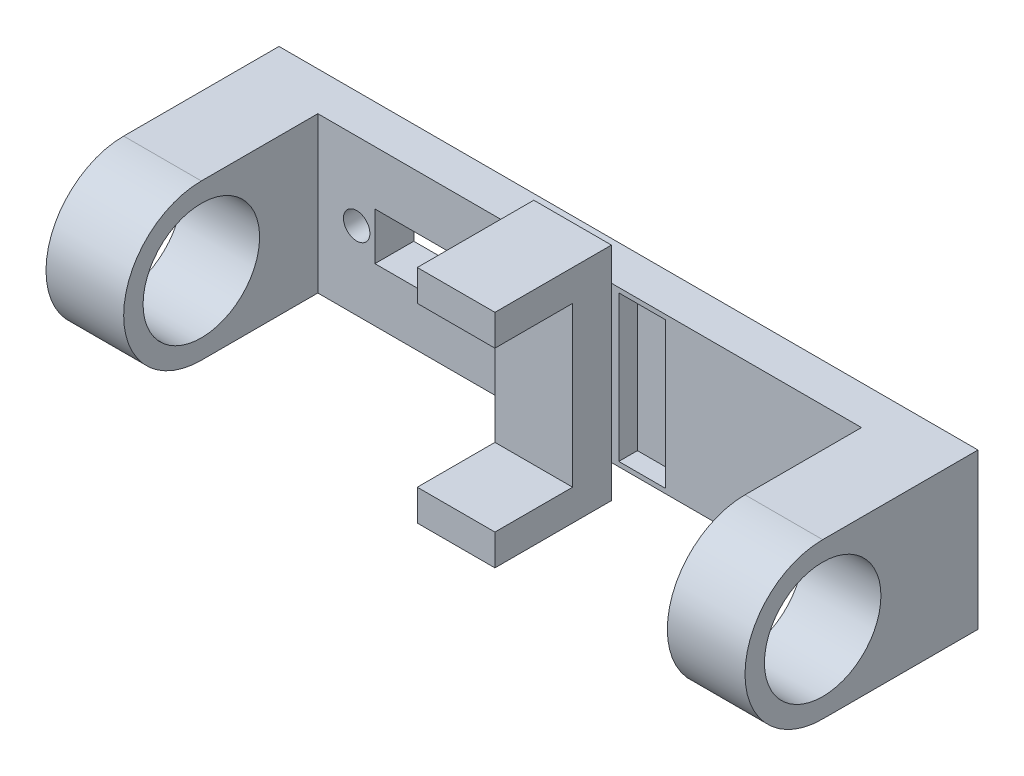
ISO-10303-21;
HEADER;
FILE_DESCRIPTION(('STEP AP214'),'2;1');
FILE_NAME('part.step','',(''),(''),'','','');
FILE_SCHEMA(('AUTOMOTIVE_DESIGN { 1 0 10303 214 1 1 1 1 }'));
ENDSEC;
DATA;
#1=APPLICATION_CONTEXT('core data for automotive mechanical design processes');
#2=APPLICATION_PROTOCOL_DEFINITION('international standard','automotive_design',2000,#1);
#3=PRODUCT_CONTEXT('',#1,'mechanical');
#4=PRODUCT('Part','Part','',(#3));
#5=PRODUCT_RELATED_PRODUCT_CATEGORY('part','',(#4));
#6=PRODUCT_DEFINITION_FORMATION('','',#4);
#7=PRODUCT_DEFINITION_CONTEXT('part definition',#1,'design');
#8=PRODUCT_DEFINITION('design','',#6,#7);
#9=PRODUCT_DEFINITION_SHAPE('','',#8);
#10=(LENGTH_UNIT() NAMED_UNIT(*) SI_UNIT(.MILLI.,.METRE.));
#11=(NAMED_UNIT(*) PLANE_ANGLE_UNIT() SI_UNIT($,.RADIAN.));
#12=(NAMED_UNIT(*) SI_UNIT($,.STERADIAN.) SOLID_ANGLE_UNIT());
#13=UNCERTAINTY_MEASURE_WITH_UNIT(LENGTH_MEASURE(1.E-05),#10,'distance_accuracy_value','');
#14=(GEOMETRIC_REPRESENTATION_CONTEXT(3) GLOBAL_UNCERTAINTY_ASSIGNED_CONTEXT((#13)) GLOBAL_UNIT_ASSIGNED_CONTEXT((#10,
#11,#12)) REPRESENTATION_CONTEXT('',''));
#15=CARTESIAN_POINT('',(0.,0.,0.));
#16=DIRECTION('',(0.,0.,1.));
#17=DIRECTION('',(1.,0.,0.));
#18=AXIS2_PLACEMENT_3D('',#15,#16,#17);
#19=CARTESIAN_POINT('',(0.,0.,10.));
#20=DIRECTION('',(0.,0.,1.));
#21=DIRECTION('',(1.,0.,0.));
#22=AXIS2_PLACEMENT_3D('',#19,#20,#21);
#23=PLANE('',#22);
#24=DIRECTION('',(0.,-1.,0.));
#25=VECTOR('',#24,1.);
#26=CARTESIAN_POINT('',(37.8030734964749,24.2512093375647,10.));
#27=LINE('',#26,#25);
#28=CARTESIAN_POINT('',(37.8030734964749,20.2512093375647,10.));
#29=VERTEX_POINT('',#28);
#30=CARTESIAN_POINT('',(37.8030734964749,-0.248790662435282,10.));
#31=VERTEX_POINT('',#30);
#32=EDGE_CURVE('E284',#29,#31,#27,.T.);
#33=ORIENTED_EDGE('',*,*,#32,.T.);
#34=DIRECTION('',(-1.,0.,0.));
#35=VECTOR('',#34,1.);
#36=CARTESIAN_POINT('',(37.8030734964749,-0.248790662435282,10.));
#37=LINE('',#36,#35);
#38=CARTESIAN_POINT('',(47.8030734964749,-0.248790662435282,10.));
#39=VERTEX_POINT('',#38);
#40=EDGE_CURVE('E245',#39,#31,#37,.T.);
#41=ORIENTED_EDGE('',*,*,#40,.F.);
#42=DIRECTION('',(0.,1.,0.));
#43=VECTOR('',#42,1.);
#44=CARTESIAN_POINT('',(47.8030734964749,24.2512093375647,10.));
#45=LINE('',#44,#43);
#46=CARTESIAN_POINT('',(47.8030734964749,20.2512093375647,10.));
#47=VERTEX_POINT('',#46);
#48=EDGE_CURVE('E287',#39,#47,#45,.T.);
#49=ORIENTED_EDGE('',*,*,#48,.T.);
#50=DIRECTION('',(1.,0.,0.));
#51=VECTOR('',#50,1.);
#52=CARTESIAN_POINT('',(37.8030734964749,20.2512093375647,10.));
#53=LINE('',#52,#51);
#54=EDGE_CURVE('E65',#29,#47,#53,.T.);
#55=ORIENTED_EDGE('',*,*,#54,.F.);
#56=EDGE_LOOP('',(#33,#41,#49,#55));
#57=FACE_BOUND('',#56,.T.);
#58=ADVANCED_FACE('F41',(#57),#23,.T.);
#59=CARTESIAN_POINT('',(0.,0.,5.));
#60=DIRECTION('',(0.,0.,-1.));
#61=DIRECTION('',(-1.,0.,0.));
#62=AXIS2_PLACEMENT_3D('',#59,#60,#61);
#63=PLANE('',#62);
#64=DIRECTION('',(0.,1.,0.));
#65=VECTOR('',#64,1.);
#66=CARTESIAN_POINT('',(32.35,13.05,5.));
#67=LINE('',#66,#65);
#68=CARTESIAN_POINT('',(32.35,6.95000000000001,5.));
#69=VERTEX_POINT('',#68);
#70=CARTESIAN_POINT('',(32.35,13.05,5.));
#71=VERTEX_POINT('',#70);
#72=EDGE_CURVE('E340',#69,#71,#67,.T.);
#73=ORIENTED_EDGE('',*,*,#72,.F.);
#74=DIRECTION('',(1.,0.,0.));
#75=VECTOR('',#74,1.);
#76=CARTESIAN_POINT('',(17.35,6.95,5.));
#77=LINE('',#76,#75);
#78=CARTESIAN_POINT('',(17.35,6.95,5.));
#79=VERTEX_POINT('',#78);
#80=EDGE_CURVE('E344',#79,#69,#77,.T.);
#81=ORIENTED_EDGE('',*,*,#80,.F.);
#82=DIRECTION('',(0.,-1.,0.));
#83=VECTOR('',#82,1.);
#84=CARTESIAN_POINT('',(17.35,13.05,5.));
#85=LINE('',#84,#83);
#86=CARTESIAN_POINT('',(17.35,13.05,5.));
#87=VERTEX_POINT('',#86);
#88=EDGE_CURVE('E335',#87,#79,#85,.T.);
#89=ORIENTED_EDGE('',*,*,#88,.F.);
#90=DIRECTION('',(-1.,0.,0.));
#91=VECTOR('',#90,1.);
#92=CARTESIAN_POINT('',(17.35,13.05,5.));
#93=LINE('',#92,#91);
#94=EDGE_CURVE('E336',#71,#87,#93,.T.);
#95=ORIENTED_EDGE('',*,*,#94,.F.);
#96=EDGE_LOOP('',(#73,#81,#89,#95));
#97=FACE_BOUND('',#96,.T.);
#98=CARTESIAN_POINT('',(15.,10.,5.));
#99=DIRECTION('',(0.,0.,1.));
#100=DIRECTION('',(1.,0.,0.));
#101=AXIS2_PLACEMENT_3D('',#98,#99,#100);
#102=CIRCLE('',#101,1.7);
#103=CARTESIAN_POINT('',(16.7,10.,5.));
#104=VERTEX_POINT('',#103);
#105=EDGE_CURVE('E319',#104,#104,#102,.T.);
#106=ORIENTED_EDGE('',*,*,#105,.F.);
#107=EDGE_LOOP('',(#106));
#108=FACE_BOUND('',#107,.T.);
#109=DIRECTION('',(0.,-1.,0.));
#110=VECTOR('',#109,1.);
#111=CARTESIAN_POINT('',(37.8030734964749,24.2512093375647,5.));
#112=LINE('',#111,#110);
#113=CARTESIAN_POINT('',(37.8030734964749,20.,5.));
#114=VERTEX_POINT('',#113);
#115=CARTESIAN_POINT('',(37.8030734964749,0.,5.));
#116=VERTEX_POINT('',#115);
#117=EDGE_CURVE('E296',#114,#116,#112,.T.);
#118=ORIENTED_EDGE('',*,*,#117,.F.);
#119=DIRECTION('',(-1.,0.,0.));
#120=VECTOR('',#119,1.);
#121=CARTESIAN_POINT('',(0.,20.,5.));
#122=LINE('',#121,#120);
#123=CARTESIAN_POINT('',(10.,20.,5.));
#124=VERTEX_POINT('',#123);
#125=EDGE_CURVE('E494',#114,#124,#122,.T.);
#126=ORIENTED_EDGE('',*,*,#125,.T.);
#127=DIRECTION('',(0.,1.,0.));
#128=VECTOR('',#127,1.);
#129=CARTESIAN_POINT('',(10.,0.,5.));
#130=LINE('',#129,#128);
#131=CARTESIAN_POINT('',(10.,0.,5.));
#132=VERTEX_POINT('',#131);
#133=EDGE_CURVE('E478',#132,#124,#130,.T.);
#134=ORIENTED_EDGE('',*,*,#133,.F.);
#135=DIRECTION('',(1.,0.,0.));
#136=VECTOR('',#135,1.);
#137=CARTESIAN_POINT('',(0.,0.,5.));
#138=LINE('',#137,#136);
#139=EDGE_CURVE('E490',#132,#116,#138,.T.);
#140=ORIENTED_EDGE('',*,*,#139,.T.);
#141=EDGE_LOOP('',(#118,#126,#134,#140));
#142=FACE_BOUND('',#141,.T.);
#143=ADVANCED_FACE('F584',(#97,#108,#142),#63,.F.);
#144=DIRECTION('',(0.,1.,0.));
#145=VECTOR('',#144,1.);
#146=CARTESIAN_POINT('',(54.75,19.4,5.));
#147=LINE('',#146,#145);
#148=CARTESIAN_POINT('',(54.75,0.600000000000001,5.));
#149=VERTEX_POINT('',#148);
#150=CARTESIAN_POINT('',(54.75,19.4,5.));
#151=VERTEX_POINT('',#150);
#152=EDGE_CURVE('E384',#149,#151,#147,.T.);
#153=ORIENTED_EDGE('',*,*,#152,.F.);
#154=DIRECTION('',(1.,0.,0.));
#155=VECTOR('',#154,1.);
#156=CARTESIAN_POINT('',(48.75,0.6,5.));
#157=LINE('',#156,#155);
#158=CARTESIAN_POINT('',(48.75,0.6,5.));
#159=VERTEX_POINT('',#158);
#160=EDGE_CURVE('E388',#159,#149,#157,.T.);
#161=ORIENTED_EDGE('',*,*,#160,.F.);
#162=DIRECTION('',(0.,-1.,0.));
#163=VECTOR('',#162,1.);
#164=CARTESIAN_POINT('',(48.75,19.4,5.));
#165=LINE('',#164,#163);
#166=CARTESIAN_POINT('',(48.75,19.4,5.));
#167=VERTEX_POINT('',#166);
#168=EDGE_CURVE('E379',#167,#159,#165,.T.);
#169=ORIENTED_EDGE('',*,*,#168,.F.);
#170=DIRECTION('',(-1.,0.,0.));
#171=VECTOR('',#170,1.);
#172=CARTESIAN_POINT('',(48.75,19.4,5.));
#173=LINE('',#172,#171);
#174=EDGE_CURVE('E380',#151,#167,#173,.T.);
#175=ORIENTED_EDGE('',*,*,#174,.F.);
#176=EDGE_LOOP('',(#153,#161,#169,#175));
#177=FACE_BOUND('',#176,.T.);
#178=CARTESIAN_POINT('',(75.,10.,5.));
#179=DIRECTION('',(0.,0.,1.));
#180=DIRECTION('',(1.,0.,0.));
#181=AXIS2_PLACEMENT_3D('',#178,#179,#180);
#182=CIRCLE('',#181,1.69999999999999);
#183=CARTESIAN_POINT('',(76.7,10.,5.));
#184=VERTEX_POINT('',#183);
#185=EDGE_CURVE('E327',#184,#184,#182,.T.);
#186=ORIENTED_EDGE('',*,*,#185,.F.);
#187=EDGE_LOOP('',(#186));
#188=FACE_BOUND('',#187,.T.);
#189=DIRECTION('',(0.,1.,0.));
#190=VECTOR('',#189,1.);
#191=CARTESIAN_POINT('',(47.8030734964749,24.2512093375647,5.));
#192=LINE('',#191,#190);
#193=CARTESIAN_POINT('',(47.8030734964749,0.,5.));
#194=VERTEX_POINT('',#193);
#195=CARTESIAN_POINT('',(47.8030734964749,20.,5.));
#196=VERTEX_POINT('',#195);
#197=EDGE_CURVE('E304',#194,#196,#192,.T.);
#198=ORIENTED_EDGE('',*,*,#197,.F.);
#199=CARTESIAN_POINT('',(80.,0.,5.));
#200=VERTEX_POINT('',#199);
#201=EDGE_CURVE('E495',#194,#200,#138,.T.);
#202=ORIENTED_EDGE('',*,*,#201,.T.);
#203=DIRECTION('',(0.,1.,0.));
#204=VECTOR('',#203,1.);
#205=CARTESIAN_POINT('',(80.,0.,5.));
#206=LINE('',#205,#204);
#207=CARTESIAN_POINT('',(80.,20.,5.));
#208=VERTEX_POINT('',#207);
#209=EDGE_CURVE('E446',#200,#208,#206,.T.);
#210=ORIENTED_EDGE('',*,*,#209,.T.);
#211=EDGE_CURVE('E496',#208,#196,#122,.T.);
#212=ORIENTED_EDGE('',*,*,#211,.T.);
#213=EDGE_LOOP('',(#198,#202,#210,#212));
#214=FACE_BOUND('',#213,.T.);
#215=ADVANCED_FACE('F611',(#177,#188,#214),#63,.F.);
#216=CARTESIAN_POINT('',(0.,0.,0.));
#217=DIRECTION('',(0.,0.,-1.));
#218=DIRECTION('',(-1.,0.,0.));
#219=AXIS2_PLACEMENT_3D('',#216,#217,#218);
#220=PLANE('',#219);
#221=DIRECTION('',(0.,-1.,0.));
#222=VECTOR('',#221,1.);
#223=CARTESIAN_POINT('',(0.,0.,0.));
#224=LINE('',#223,#222);
#225=CARTESIAN_POINT('',(0.,20.,0.));
#226=VERTEX_POINT('',#225);
#227=CARTESIAN_POINT('',(0.,0.,0.));
#228=VERTEX_POINT('',#227);
#229=EDGE_CURVE('E489',#226,#228,#224,.T.);
#230=ORIENTED_EDGE('',*,*,#229,.F.);
#231=DIRECTION('',(-1.,0.,0.));
#232=VECTOR('',#231,1.);
#233=CARTESIAN_POINT('',(0.,20.,0.));
#234=LINE('',#233,#232);
#235=CARTESIAN_POINT('',(90.,20.,0.));
#236=VERTEX_POINT('',#235);
#237=EDGE_CURVE('E513',#236,#226,#234,.T.);
#238=ORIENTED_EDGE('',*,*,#237,.F.);
#239=DIRECTION('',(0.,1.,0.));
#240=VECTOR('',#239,1.);
#241=CARTESIAN_POINT('',(90.,0.,0.));
#242=LINE('',#241,#240);
#243=CARTESIAN_POINT('',(90.,0.,0.));
#244=VERTEX_POINT('',#243);
#245=EDGE_CURVE('E509',#244,#236,#242,.T.);
#246=ORIENTED_EDGE('',*,*,#245,.F.);
#247=DIRECTION('',(1.,0.,0.));
#248=VECTOR('',#247,1.);
#249=CARTESIAN_POINT('',(0.,0.,0.));
#250=LINE('',#249,#248);
#251=EDGE_CURVE('E505',#228,#244,#250,.T.);
#252=ORIENTED_EDGE('',*,*,#251,.F.);
#253=EDGE_LOOP('',(#230,#238,#246,#252));
#254=FACE_BOUND('',#253,.T.);
#255=DIRECTION('',(1.,0.,0.));
#256=VECTOR('',#255,1.);
#257=CARTESIAN_POINT('',(17.35,6.95,0.));
#258=LINE('',#257,#256);
#259=CARTESIAN_POINT('',(17.35,6.95,0.));
#260=VERTEX_POINT('',#259);
#261=CARTESIAN_POINT('',(32.35,6.95000000000001,0.));
#262=VERTEX_POINT('',#261);
#263=EDGE_CURVE('E339',#260,#262,#258,.T.);
#264=ORIENTED_EDGE('',*,*,#263,.T.);
#265=DIRECTION('',(0.,1.,0.));
#266=VECTOR('',#265,1.);
#267=CARTESIAN_POINT('',(32.35,13.05,0.));
#268=LINE('',#267,#266);
#269=CARTESIAN_POINT('',(32.35,13.05,0.));
#270=VERTEX_POINT('',#269);
#271=EDGE_CURVE('E366',#262,#270,#268,.T.);
#272=ORIENTED_EDGE('',*,*,#271,.T.);
#273=DIRECTION('',(-1.,0.,0.));
#274=VECTOR('',#273,1.);
#275=CARTESIAN_POINT('',(17.35,13.05,0.));
#276=LINE('',#275,#274);
#277=CARTESIAN_POINT('',(17.35,13.05,0.));
#278=VERTEX_POINT('',#277);
#279=EDGE_CURVE('E361',#270,#278,#276,.T.);
#280=ORIENTED_EDGE('',*,*,#279,.T.);
#281=DIRECTION('',(0.,-1.,0.));
#282=VECTOR('',#281,1.);
#283=CARTESIAN_POINT('',(17.35,13.05,0.));
#284=LINE('',#283,#282);
#285=EDGE_CURVE('E355',#278,#260,#284,.T.);
#286=ORIENTED_EDGE('',*,*,#285,.T.);
#287=EDGE_LOOP('',(#264,#272,#280,#286));
#288=FACE_BOUND('',#287,.T.);
#289=CARTESIAN_POINT('',(75.,10.,0.));
#290=DIRECTION('',(0.,0.,1.));
#291=DIRECTION('',(1.,0.,0.));
#292=AXIS2_PLACEMENT_3D('',#289,#290,#291);
#293=CIRCLE('',#292,1.69999999999999);
#294=CARTESIAN_POINT('',(76.7,10.,0.));
#295=VERTEX_POINT('',#294);
#296=EDGE_CURVE('E331',#295,#295,#293,.T.);
#297=ORIENTED_EDGE('',*,*,#296,.T.);
#298=EDGE_LOOP('',(#297));
#299=FACE_BOUND('',#298,.T.);
#300=CARTESIAN_POINT('',(15.,10.,0.));
#301=DIRECTION('',(0.,0.,1.));
#302=DIRECTION('',(1.,0.,0.));
#303=AXIS2_PLACEMENT_3D('',#300,#301,#302);
#304=CIRCLE('',#303,1.7);
#305=CARTESIAN_POINT('',(16.7,10.,0.));
#306=VERTEX_POINT('',#305);
#307=EDGE_CURVE('E323',#306,#306,#304,.T.);
#308=ORIENTED_EDGE('',*,*,#307,.T.);
#309=EDGE_LOOP('',(#308));
#310=FACE_BOUND('',#309,.T.);
#311=ADVANCED_FACE('F536',(#254,#288,#299,#310),#220,.T.);
#312=CARTESIAN_POINT('',(0.,0.,5.));
#313=DIRECTION('',(0.,1.,0.));
#314=DIRECTION('',(0.,0.,1.));
#315=AXIS2_PLACEMENT_3D('',#312,#313,#314);
#316=PLANE('',#315);
#317=DIRECTION('',(1.,0.,0.));
#318=VECTOR('',#317,1.);
#319=CARTESIAN_POINT('',(-15.,0.,20.));
#320=LINE('',#319,#318);
#321=CARTESIAN_POINT('',(80.,0.,20.));
#322=VERTEX_POINT('',#321);
#323=CARTESIAN_POINT('',(90.,0.,20.));
#324=VERTEX_POINT('',#323);
#325=EDGE_CURVE('E433',#322,#324,#320,.T.);
#326=ORIENTED_EDGE('',*,*,#325,.F.);
#327=DIRECTION('',(0.,0.,-1.));
#328=VECTOR('',#327,1.);
#329=CARTESIAN_POINT('',(80.,0.,35.));
#330=LINE('',#329,#328);
#331=EDGE_CURVE('E450',#322,#200,#330,.T.);
#332=ORIENTED_EDGE('',*,*,#331,.T.);
#333=ORIENTED_EDGE('',*,*,#201,.F.);
#334=DIRECTION('',(1.,0.,0.));
#335=VECTOR('',#334,1.);
#336=CARTESIAN_POINT('',(0.,0.,5.));
#337=LINE('',#336,#335);
#338=EDGE_CURVE('E229',#116,#194,#337,.T.);
#339=ORIENTED_EDGE('',*,*,#338,.F.);
#340=ORIENTED_EDGE('',*,*,#139,.F.);
#341=DIRECTION('',(0.,0.,-1.));
#342=VECTOR('',#341,1.);
#343=CARTESIAN_POINT('',(10.,0.,35.));
#344=LINE('',#343,#342);
#345=CARTESIAN_POINT('',(10.,0.,20.));
#346=VERTEX_POINT('',#345);
#347=EDGE_CURVE('E486',#346,#132,#344,.T.);
#348=ORIENTED_EDGE('',*,*,#347,.F.);
#349=DIRECTION('',(-1.,0.,0.));
#350=VECTOR('',#349,1.);
#351=CARTESIAN_POINT('',(35.,0.,20.));
#352=LINE('',#351,#350);
#353=CARTESIAN_POINT('',(0.,0.,20.));
#354=VERTEX_POINT('',#353);
#355=EDGE_CURVE('E462',#346,#354,#352,.T.);
#356=ORIENTED_EDGE('',*,*,#355,.T.);
#357=DIRECTION('',(0.,0.,-1.));
#358=VECTOR('',#357,1.);
#359=CARTESIAN_POINT('',(0.,0.,5.));
#360=LINE('',#359,#358);
#361=EDGE_CURVE('E12',#354,#228,#360,.T.);
#362=ORIENTED_EDGE('',*,*,#361,.T.);
#363=ORIENTED_EDGE('',*,*,#251,.T.);
#364=DIRECTION('',(0.,0.,-1.));
#365=VECTOR('',#364,1.);
#366=CARTESIAN_POINT('',(90.,0.,5.));
#367=LINE('',#366,#365);
#368=EDGE_CURVE('E50',#324,#244,#367,.T.);
#369=ORIENTED_EDGE('',*,*,#368,.F.);
#370=EDGE_LOOP('',(#326,#332,#333,#339,#340,#348,#356,#362,#363,#369));
#371=FACE_BOUND('',#370,.T.);
#372=ADVANCED_FACE('F532',(#371),#316,.F.);
#373=CARTESIAN_POINT('',(0.,0.,5.));
#374=DIRECTION('',(1.,0.,0.));
#375=DIRECTION('',(0.,0.,-1.));
#376=AXIS2_PLACEMENT_3D('',#373,#374,#375);
#377=PLANE('',#376);
#378=CARTESIAN_POINT('',(0.,10.,20.));
#379=DIRECTION('',(-1.,0.,0.));
#380=DIRECTION('',(0.,0.,1.));
#381=AXIS2_PLACEMENT_3D('',#378,#379,#380);
#382=CIRCLE('',#381,7.5);
#383=CARTESIAN_POINT('',(0.,10.,27.5));
#384=VERTEX_POINT('',#383);
#385=EDGE_CURVE('E461',#384,#384,#382,.T.);
#386=ORIENTED_EDGE('',*,*,#385,.F.);
#387=EDGE_LOOP('',(#386));
#388=FACE_BOUND('',#387,.T.);
#389=ORIENTED_EDGE('',*,*,#361,.F.);
#390=CARTESIAN_POINT('',(0.,10.,20.));
#391=DIRECTION('',(1.,0.,0.));
#392=DIRECTION('',(0.,0.,1.));
#393=AXIS2_PLACEMENT_3D('',#390,#391,#392);
#394=CIRCLE('',#393,10.);
#395=CARTESIAN_POINT('',(0.,20.,20.));
#396=VERTEX_POINT('',#395);
#397=EDGE_CURVE('E457',#396,#354,#394,.T.);
#398=ORIENTED_EDGE('',*,*,#397,.F.);
#399=DIRECTION('',(0.,0.,-1.));
#400=VECTOR('',#399,1.);
#401=CARTESIAN_POINT('',(0.,20.,5.));
#402=LINE('',#401,#400);
#403=EDGE_CURVE('E500',#396,#226,#402,.T.);
#404=ORIENTED_EDGE('',*,*,#403,.T.);
#405=ORIENTED_EDGE('',*,*,#229,.T.);
#406=EDGE_LOOP('',(#389,#398,#404,#405));
#407=FACE_BOUND('',#406,.T.);
#408=ADVANCED_FACE('F43',(#388,#407),#377,.F.);
#409=CARTESIAN_POINT('',(90.,0.,5.));
#410=DIRECTION('',(-1.,0.,0.));
#411=DIRECTION('',(0.,0.,1.));
#412=AXIS2_PLACEMENT_3D('',#409,#410,#411);
#413=PLANE('',#412);
#414=CARTESIAN_POINT('',(90.,10.,20.));
#415=DIRECTION('',(1.,0.,0.));
#416=DIRECTION('',(0.,0.,1.));
#417=AXIS2_PLACEMENT_3D('',#414,#415,#416);
#418=CIRCLE('',#417,10.);
#419=CARTESIAN_POINT('',(90.,20.,20.));
#420=VERTEX_POINT('',#419);
#421=EDGE_CURVE('E423',#420,#324,#418,.T.);
#422=ORIENTED_EDGE('',*,*,#421,.T.);
#423=ORIENTED_EDGE('',*,*,#368,.T.);
#424=ORIENTED_EDGE('',*,*,#245,.T.);
#425=DIRECTION('',(0.,0.,-1.));
#426=VECTOR('',#425,1.);
#427=CARTESIAN_POINT('',(90.,20.,5.));
#428=LINE('',#427,#426);
#429=EDGE_CURVE('E519',#420,#236,#428,.T.);
#430=ORIENTED_EDGE('',*,*,#429,.F.);
#431=EDGE_LOOP('',(#422,#423,#424,#430));
#432=FACE_BOUND('',#431,.T.);
#433=CARTESIAN_POINT('',(90.,10.,20.));
#434=DIRECTION('',(-1.,0.,0.));
#435=DIRECTION('',(0.,0.,1.));
#436=AXIS2_PLACEMENT_3D('',#433,#434,#435);
#437=CIRCLE('',#436,7.5);
#438=CARTESIAN_POINT('',(90.,10.,27.5));
#439=VERTEX_POINT('',#438);
#440=EDGE_CURVE('E428',#439,#439,#437,.T.);
#441=ORIENTED_EDGE('',*,*,#440,.T.);
#442=EDGE_LOOP('',(#441));
#443=FACE_BOUND('',#442,.T.);
#444=ADVANCED_FACE('F524',(#432,#443),#413,.F.);
#445=CARTESIAN_POINT('',(0.,20.,5.));
#446=DIRECTION('',(0.,-1.,0.));
#447=DIRECTION('',(0.,0.,-1.));
#448=AXIS2_PLACEMENT_3D('',#445,#446,#447);
#449=PLANE('',#448);
#450=DIRECTION('',(0.,0.,-1.));
#451=VECTOR('',#450,1.);
#452=CARTESIAN_POINT('',(80.,20.,35.));
#453=LINE('',#452,#451);
#454=CARTESIAN_POINT('',(80.,20.,20.));
#455=VERTEX_POINT('',#454);
#456=EDGE_CURVE('E454',#455,#208,#453,.T.);
#457=ORIENTED_EDGE('',*,*,#456,.F.);
#458=DIRECTION('',(1.,0.,0.));
#459=VECTOR('',#458,1.);
#460=CARTESIAN_POINT('',(-15.,20.,20.));
#461=LINE('',#460,#459);
#462=EDGE_CURVE('E429',#455,#420,#461,.T.);
#463=ORIENTED_EDGE('',*,*,#462,.T.);
#464=ORIENTED_EDGE('',*,*,#429,.T.);
#465=ORIENTED_EDGE('',*,*,#237,.T.);
#466=ORIENTED_EDGE('',*,*,#403,.F.);
#467=DIRECTION('',(-1.,0.,0.));
#468=VECTOR('',#467,1.);
#469=CARTESIAN_POINT('',(35.,20.,20.));
#470=LINE('',#469,#468);
#471=CARTESIAN_POINT('',(10.,20.,20.));
#472=VERTEX_POINT('',#471);
#473=EDGE_CURVE('E465',#472,#396,#470,.T.);
#474=ORIENTED_EDGE('',*,*,#473,.F.);
#475=DIRECTION('',(0.,0.,-1.));
#476=VECTOR('',#475,1.);
#477=CARTESIAN_POINT('',(10.,20.,35.));
#478=LINE('',#477,#476);
#479=EDGE_CURVE('E482',#472,#124,#478,.T.);
#480=ORIENTED_EDGE('',*,*,#479,.T.);
#481=ORIENTED_EDGE('',*,*,#125,.F.);
#482=EDGE_CURVE('E501',#196,#114,#122,.T.);
#483=ORIENTED_EDGE('',*,*,#482,.F.);
#484=ORIENTED_EDGE('',*,*,#211,.F.);
#485=EDGE_LOOP('',(#457,#463,#464,#465,#466,#474,#480,#481,#483,#484));
#486=FACE_BOUND('',#485,.T.);
#487=ADVANCED_FACE('F541',(#486),#449,.F.);
#488=CARTESIAN_POINT('',(10.,0.,35.));
#489=DIRECTION('',(-1.,0.,0.));
#490=DIRECTION('',(0.,0.,1.));
#491=AXIS2_PLACEMENT_3D('',#488,#489,#490);
#492=PLANE('',#491);
#493=CARTESIAN_POINT('',(10.,10.,20.));
#494=DIRECTION('',(-1.,0.,0.));
#495=DIRECTION('',(0.,0.,1.));
#496=AXIS2_PLACEMENT_3D('',#493,#494,#495);
#497=CIRCLE('',#496,7.5);
#498=CARTESIAN_POINT('',(10.,10.,27.5));
#499=VERTEX_POINT('',#498);
#500=EDGE_CURVE('E474',#499,#499,#497,.F.);
#501=ORIENTED_EDGE('',*,*,#500,.F.);
#502=EDGE_LOOP('',(#501));
#503=FACE_BOUND('',#502,.T.);
#504=ORIENTED_EDGE('',*,*,#479,.F.);
#505=CARTESIAN_POINT('',(10.,10.,20.));
#506=DIRECTION('',(-1.,0.,0.));
#507=DIRECTION('',(0.,0.,1.));
#508=AXIS2_PLACEMENT_3D('',#505,#506,#507);
#509=CIRCLE('',#508,10.);
#510=EDGE_CURVE('E458',#346,#472,#509,.T.);
#511=ORIENTED_EDGE('',*,*,#510,.F.);
#512=ORIENTED_EDGE('',*,*,#347,.T.);
#513=ORIENTED_EDGE('',*,*,#133,.T.);
#514=EDGE_LOOP('',(#504,#511,#512,#513));
#515=FACE_BOUND('',#514,.T.);
#516=ADVANCED_FACE('F588',(#503,#515),#492,.F.);
#517=CARTESIAN_POINT('',(35.,10.,20.));
#518=DIRECTION('',(-1.,0.,0.));
#519=DIRECTION('',(0.,0.,1.));
#520=AXIS2_PLACEMENT_3D('',#517,#518,#519);
#521=CYLINDRICAL_SURFACE('',#520,7.5);
#522=ORIENTED_EDGE('',*,*,#500,.T.);
#523=EDGE_LOOP('',(#522));
#524=FACE_BOUND('',#523,.T.);
#525=ORIENTED_EDGE('',*,*,#385,.T.);
#526=EDGE_LOOP('',(#525));
#527=FACE_BOUND('',#526,.T.);
#528=ADVANCED_FACE('F595',(#524,#527),#521,.F.);
#529=CARTESIAN_POINT('',(35.,10.,20.));
#530=DIRECTION('',(-1.,0.,0.));
#531=DIRECTION('',(0.,0.,1.));
#532=AXIS2_PLACEMENT_3D('',#529,#530,#531);
#533=CYLINDRICAL_SURFACE('',#532,10.);
#534=ORIENTED_EDGE('',*,*,#510,.T.);
#535=ORIENTED_EDGE('',*,*,#473,.T.);
#536=ORIENTED_EDGE('',*,*,#397,.T.);
#537=ORIENTED_EDGE('',*,*,#355,.F.);
#538=EDGE_LOOP('',(#534,#535,#536,#537));
#539=FACE_BOUND('',#538,.T.);
#540=ADVANCED_FACE('F593',(#539),#533,.T.);
#541=CARTESIAN_POINT('',(80.,0.,35.));
#542=DIRECTION('',(-1.,0.,0.));
#543=DIRECTION('',(0.,0.,1.));
#544=AXIS2_PLACEMENT_3D('',#541,#542,#543);
#545=PLANE('',#544);
#546=CARTESIAN_POINT('',(80.,10.,20.));
#547=DIRECTION('',(1.,0.,0.));
#548=DIRECTION('',(0.,0.,-1.));
#549=AXIS2_PLACEMENT_3D('',#546,#547,#548);
#550=CIRCLE('',#549,7.5);
#551=CARTESIAN_POINT('',(80.,10.,12.5));
#552=VERTEX_POINT('',#551);
#553=EDGE_CURVE('E442',#552,#552,#550,.T.);
#554=ORIENTED_EDGE('',*,*,#553,.T.);
#555=EDGE_LOOP('',(#554));
#556=FACE_BOUND('',#555,.T.);
#557=ORIENTED_EDGE('',*,*,#331,.F.);
#558=CARTESIAN_POINT('',(80.,10.,20.));
#559=DIRECTION('',(1.,0.,0.));
#560=DIRECTION('',(0.,0.,-1.));
#561=AXIS2_PLACEMENT_3D('',#558,#559,#560);
#562=CIRCLE('',#561,10.);
#563=EDGE_CURVE('E424',#322,#455,#562,.F.);
#564=ORIENTED_EDGE('',*,*,#563,.T.);
#565=ORIENTED_EDGE('',*,*,#456,.T.);
#566=ORIENTED_EDGE('',*,*,#209,.F.);
#567=EDGE_LOOP('',(#557,#564,#565,#566));
#568=FACE_BOUND('',#567,.T.);
#569=ADVANCED_FACE('F548',(#556,#568),#545,.T.);
#570=CARTESIAN_POINT('',(-15.,10.,20.));
#571=DIRECTION('',(1.,0.,0.));
#572=DIRECTION('',(0.,0.,-1.));
#573=AXIS2_PLACEMENT_3D('',#570,#571,#572);
#574=CYLINDRICAL_SURFACE('',#573,7.5);
#575=ORIENTED_EDGE('',*,*,#553,.F.);
#576=EDGE_LOOP('',(#575));
#577=FACE_BOUND('',#576,.T.);
#578=ORIENTED_EDGE('',*,*,#440,.F.);
#579=EDGE_LOOP('',(#578));
#580=FACE_BOUND('',#579,.T.);
#581=ADVANCED_FACE('F601',(#577,#580),#574,.F.);
#582=CARTESIAN_POINT('',(-15.,10.,20.));
#583=DIRECTION('',(1.,0.,0.));
#584=DIRECTION('',(0.,0.,-1.));
#585=AXIS2_PLACEMENT_3D('',#582,#583,#584);
#586=CYLINDRICAL_SURFACE('',#585,10.);
#587=ORIENTED_EDGE('',*,*,#325,.T.);
#588=ORIENTED_EDGE('',*,*,#421,.F.);
#589=ORIENTED_EDGE('',*,*,#462,.F.);
#590=ORIENTED_EDGE('',*,*,#563,.F.);
#591=EDGE_LOOP('',(#587,#588,#589,#590));
#592=FACE_BOUND('',#591,.T.);
#593=ADVANCED_FACE('F545',(#592),#586,.T.);
#594=CARTESIAN_POINT('',(0.,0.,2.6));
#595=DIRECTION('',(0.,0.,-1.));
#596=DIRECTION('',(-1.,0.,0.));
#597=AXIS2_PLACEMENT_3D('',#594,#595,#596);
#598=PLANE('',#597);
#599=DIRECTION('',(0.,-1.,0.));
#600=VECTOR('',#599,1.);
#601=CARTESIAN_POINT('',(48.75,19.4,2.6));
#602=LINE('',#601,#600);
#603=CARTESIAN_POINT('',(48.75,19.4,2.6));
#604=VERTEX_POINT('',#603);
#605=CARTESIAN_POINT('',(48.75,0.6,2.6));
#606=VERTEX_POINT('',#605);
#607=EDGE_CURVE('E399',#604,#606,#602,.T.);
#608=ORIENTED_EDGE('',*,*,#607,.T.);
#609=DIRECTION('',(1.,0.,0.));
#610=VECTOR('',#609,1.);
#611=CARTESIAN_POINT('',(48.75,0.6,2.6));
#612=LINE('',#611,#610);
#613=CARTESIAN_POINT('',(54.75,0.600000000000001,2.59999999999999));
#614=VERTEX_POINT('',#613);
#615=EDGE_CURVE('E383',#606,#614,#612,.T.);
#616=ORIENTED_EDGE('',*,*,#615,.T.);
#617=DIRECTION('',(0.,1.,0.));
#618=VECTOR('',#617,1.);
#619=CARTESIAN_POINT('',(54.75,19.4,2.6));
#620=LINE('',#619,#618);
#621=CARTESIAN_POINT('',(54.75,19.4,2.6));
#622=VERTEX_POINT('',#621);
#623=EDGE_CURVE('E410',#614,#622,#620,.T.);
#624=ORIENTED_EDGE('',*,*,#623,.T.);
#625=DIRECTION('',(-1.,0.,0.));
#626=VECTOR('',#625,1.);
#627=CARTESIAN_POINT('',(48.75,19.4,2.6));
#628=LINE('',#627,#626);
#629=EDGE_CURVE('E405',#622,#604,#628,.T.);
#630=ORIENTED_EDGE('',*,*,#629,.T.);
#631=EDGE_LOOP('',(#608,#616,#624,#630));
#632=FACE_BOUND('',#631,.T.);
#633=ADVANCED_FACE('F666',(#632),#598,.F.);
#634=CARTESIAN_POINT('',(48.75,0.6,-19.7342342136704));
#635=DIRECTION('',(0.,-1.,0.));
#636=DIRECTION('',(1.,0.,0.));
#637=AXIS2_PLACEMENT_3D('',#634,#635,#636);
#638=PLANE('',#637);
#639=DIRECTION('',(0.,0.,1.));
#640=VECTOR('',#639,1.);
#641=CARTESIAN_POINT('',(48.75,0.6,-19.7342342136704));
#642=LINE('',#641,#640);
#643=EDGE_CURVE('E403',#606,#159,#642,.T.);
#644=ORIENTED_EDGE('',*,*,#643,.T.);
#645=ORIENTED_EDGE('',*,*,#160,.T.);
#646=DIRECTION('',(0.,0.,1.));
#647=VECTOR('',#646,1.);
#648=CARTESIAN_POINT('',(54.75,0.600000000000001,-19.7342342136704));
#649=LINE('',#648,#647);
#650=EDGE_CURVE('E398',#614,#149,#649,.T.);
#651=ORIENTED_EDGE('',*,*,#650,.F.);
#652=ORIENTED_EDGE('',*,*,#615,.F.);
#653=EDGE_LOOP('',(#644,#645,#651,#652));
#654=FACE_BOUND('',#653,.T.);
#655=ADVANCED_FACE('F662',(#654),#638,.F.);
#656=CARTESIAN_POINT('',(54.75,19.4,-19.7342342136704));
#657=DIRECTION('',(1.,0.,0.));
#658=DIRECTION('',(0.,0.,-1.));
#659=AXIS2_PLACEMENT_3D('',#656,#657,#658);
#660=PLANE('',#659);
#661=ORIENTED_EDGE('',*,*,#650,.T.);
#662=ORIENTED_EDGE('',*,*,#152,.T.);
#663=DIRECTION('',(0.,0.,1.));
#664=VECTOR('',#663,1.);
#665=CARTESIAN_POINT('',(54.75,19.4,-19.7342342136704));
#666=LINE('',#665,#664);
#667=EDGE_CURVE('E409',#622,#151,#666,.T.);
#668=ORIENTED_EDGE('',*,*,#667,.F.);
#669=ORIENTED_EDGE('',*,*,#623,.F.);
#670=EDGE_LOOP('',(#661,#662,#668,#669));
#671=FACE_BOUND('',#670,.T.);
#672=ADVANCED_FACE('F658',(#671),#660,.F.);
#673=CARTESIAN_POINT('',(48.75,19.4,-19.7342342136704));
#674=DIRECTION('',(0.,1.,0.));
#675=DIRECTION('',(0.,0.,1.));
#676=AXIS2_PLACEMENT_3D('',#673,#674,#675);
#677=PLANE('',#676);
#678=ORIENTED_EDGE('',*,*,#667,.T.);
#679=ORIENTED_EDGE('',*,*,#174,.T.);
#680=DIRECTION('',(0.,0.,1.));
#681=VECTOR('',#680,1.);
#682=CARTESIAN_POINT('',(48.75,19.4,-19.7342342136704));
#683=LINE('',#682,#681);
#684=EDGE_CURVE('E404',#604,#167,#683,.T.);
#685=ORIENTED_EDGE('',*,*,#684,.F.);
#686=ORIENTED_EDGE('',*,*,#629,.F.);
#687=EDGE_LOOP('',(#678,#679,#685,#686));
#688=FACE_BOUND('',#687,.T.);
#689=ADVANCED_FACE('F654',(#688),#677,.F.);
#690=CARTESIAN_POINT('',(48.75,19.4,-19.7342342136704));
#691=DIRECTION('',(-1.,0.,0.));
#692=DIRECTION('',(0.,-1.,0.));
#693=AXIS2_PLACEMENT_3D('',#690,#691,#692);
#694=PLANE('',#693);
#695=ORIENTED_EDGE('',*,*,#684,.T.);
#696=ORIENTED_EDGE('',*,*,#168,.T.);
#697=ORIENTED_EDGE('',*,*,#643,.F.);
#698=ORIENTED_EDGE('',*,*,#607,.F.);
#699=EDGE_LOOP('',(#695,#696,#697,#698));
#700=FACE_BOUND('',#699,.T.);
#701=ADVANCED_FACE('F650',(#700),#694,.F.);
#702=CARTESIAN_POINT('',(17.35,6.95,-16.1928996785628));
#703=DIRECTION('',(0.,-1.,0.));
#704=DIRECTION('',(1.,0.,0.));
#705=AXIS2_PLACEMENT_3D('',#702,#703,#704);
#706=PLANE('',#705);
#707=DIRECTION('',(0.,0.,1.));
#708=VECTOR('',#707,1.);
#709=CARTESIAN_POINT('',(17.35,6.95,-16.1928996785628));
#710=LINE('',#709,#708);
#711=EDGE_CURVE('E359',#260,#79,#710,.T.);
#712=ORIENTED_EDGE('',*,*,#711,.T.);
#713=ORIENTED_EDGE('',*,*,#80,.T.);
#714=DIRECTION('',(0.,0.,1.));
#715=VECTOR('',#714,1.);
#716=CARTESIAN_POINT('',(32.35,6.95000000000001,-16.1928996785628));
#717=LINE('',#716,#715);
#718=EDGE_CURVE('E354',#262,#69,#717,.T.);
#719=ORIENTED_EDGE('',*,*,#718,.F.);
#720=ORIENTED_EDGE('',*,*,#263,.F.);
#721=EDGE_LOOP('',(#712,#713,#719,#720));
#722=FACE_BOUND('',#721,.T.);
#723=ADVANCED_FACE('F646',(#722),#706,.F.);
#724=CARTESIAN_POINT('',(32.35,13.05,-16.1928996785628));
#725=DIRECTION('',(1.,0.,0.));
#726=DIRECTION('',(0.,0.,-1.));
#727=AXIS2_PLACEMENT_3D('',#724,#725,#726);
#728=PLANE('',#727);
#729=ORIENTED_EDGE('',*,*,#718,.T.);
#730=ORIENTED_EDGE('',*,*,#72,.T.);
#731=DIRECTION('',(0.,0.,1.));
#732=VECTOR('',#731,1.);
#733=CARTESIAN_POINT('',(32.35,13.05,-16.1928996785628));
#734=LINE('',#733,#732);
#735=EDGE_CURVE('E365',#270,#71,#734,.T.);
#736=ORIENTED_EDGE('',*,*,#735,.F.);
#737=ORIENTED_EDGE('',*,*,#271,.F.);
#738=EDGE_LOOP('',(#729,#730,#736,#737));
#739=FACE_BOUND('',#738,.T.);
#740=ADVANCED_FACE('F642',(#739),#728,.F.);
#741=CARTESIAN_POINT('',(17.35,13.05,-16.1928996785628));
#742=DIRECTION('',(0.,1.,0.));
#743=DIRECTION('',(-1.,0.,0.));
#744=AXIS2_PLACEMENT_3D('',#741,#742,#743);
#745=PLANE('',#744);
#746=ORIENTED_EDGE('',*,*,#735,.T.);
#747=ORIENTED_EDGE('',*,*,#94,.T.);
#748=DIRECTION('',(0.,0.,1.));
#749=VECTOR('',#748,1.);
#750=CARTESIAN_POINT('',(17.35,13.05,-16.1928996785628));
#751=LINE('',#750,#749);
#752=EDGE_CURVE('E360',#278,#87,#751,.T.);
#753=ORIENTED_EDGE('',*,*,#752,.F.);
#754=ORIENTED_EDGE('',*,*,#279,.F.);
#755=EDGE_LOOP('',(#746,#747,#753,#754));
#756=FACE_BOUND('',#755,.T.);
#757=ADVANCED_FACE('F638',(#756),#745,.F.);
#758=CARTESIAN_POINT('',(17.35,13.05,-16.1928996785628));
#759=DIRECTION('',(-1.,0.,0.));
#760=DIRECTION('',(0.,-1.,0.));
#761=AXIS2_PLACEMENT_3D('',#758,#759,#760);
#762=PLANE('',#761);
#763=ORIENTED_EDGE('',*,*,#752,.T.);
#764=ORIENTED_EDGE('',*,*,#88,.T.);
#765=ORIENTED_EDGE('',*,*,#711,.F.);
#766=ORIENTED_EDGE('',*,*,#285,.F.);
#767=EDGE_LOOP('',(#763,#764,#765,#766));
#768=FACE_BOUND('',#767,.T.);
#769=ADVANCED_FACE('F634',(#768),#762,.F.);
#770=CARTESIAN_POINT('',(75.,10.,5.));
#771=DIRECTION('',(0.,0.,1.));
#772=DIRECTION('',(1.,0.,0.));
#773=AXIS2_PLACEMENT_3D('',#770,#771,#772);
#774=CYLINDRICAL_SURFACE('',#773,1.69999999999999);
#775=ORIENTED_EDGE('',*,*,#296,.F.);
#776=EDGE_LOOP('',(#775));
#777=FACE_BOUND('',#776,.T.);
#778=ORIENTED_EDGE('',*,*,#185,.T.);
#779=EDGE_LOOP('',(#778));
#780=FACE_BOUND('',#779,.T.);
#781=ADVANCED_FACE('F630',(#777,#780),#774,.F.);
#782=CARTESIAN_POINT('',(15.,10.,5.));
#783=DIRECTION('',(0.,0.,1.));
#784=DIRECTION('',(1.,0.,0.));
#785=AXIS2_PLACEMENT_3D('',#782,#783,#784);
#786=CYLINDRICAL_SURFACE('',#785,1.7);
#787=ORIENTED_EDGE('',*,*,#307,.F.);
#788=EDGE_LOOP('',(#787));
#789=FACE_BOUND('',#788,.T.);
#790=ORIENTED_EDGE('',*,*,#105,.T.);
#791=EDGE_LOOP('',(#790));
#792=FACE_BOUND('',#791,.T.);
#793=ADVANCED_FACE('F619',(#789,#792),#786,.F.);
#794=CARTESIAN_POINT('',(0.,0.,5.));
#795=DIRECTION('',(0.,0.,1.));
#796=DIRECTION('',(1.,0.,0.));
#797=AXIS2_PLACEMENT_3D('',#794,#795,#796);
#798=PLANE('',#797);
#799=CARTESIAN_POINT('',(37.8030734964749,-4.24879066243528,5.));
#800=VERTEX_POINT('',#799);
#801=EDGE_CURVE('E225',#116,#800,#112,.T.);
#802=ORIENTED_EDGE('',*,*,#801,.F.);
#803=ORIENTED_EDGE('',*,*,#338,.T.);
#804=CARTESIAN_POINT('',(47.8030734964749,-4.24879066243528,5.));
#805=VERTEX_POINT('',#804);
#806=EDGE_CURVE('E300',#805,#194,#192,.T.);
#807=ORIENTED_EDGE('',*,*,#806,.F.);
#808=DIRECTION('',(1.,0.,0.));
#809=VECTOR('',#808,1.);
#810=CARTESIAN_POINT('',(37.8030734964749,-4.24879066243528,5.));
#811=LINE('',#810,#809);
#812=EDGE_CURVE('E295',#800,#805,#811,.T.);
#813=ORIENTED_EDGE('',*,*,#812,.F.);
#814=EDGE_LOOP('',(#802,#803,#807,#813));
#815=FACE_BOUND('',#814,.T.);
#816=ADVANCED_FACE('F556',(#815),#798,.F.);
#817=CARTESIAN_POINT('',(47.8030734964749,24.2512093375647,5.));
#818=VERTEX_POINT('',#817);
#819=EDGE_CURVE('E299',#196,#818,#192,.T.);
#820=ORIENTED_EDGE('',*,*,#819,.F.);
#821=ORIENTED_EDGE('',*,*,#482,.T.);
#822=CARTESIAN_POINT('',(37.8030734964749,24.2512093375647,5.));
#823=VERTEX_POINT('',#822);
#824=EDGE_CURVE('E292',#823,#114,#112,.T.);
#825=ORIENTED_EDGE('',*,*,#824,.F.);
#826=DIRECTION('',(-1.,0.,0.));
#827=VECTOR('',#826,1.);
#828=CARTESIAN_POINT('',(37.8030734964749,24.2512093375647,5.));
#829=LINE('',#828,#827);
#830=EDGE_CURVE('E288',#818,#823,#829,.T.);
#831=ORIENTED_EDGE('',*,*,#830,.F.);
#832=EDGE_LOOP('',(#820,#821,#825,#831));
#833=FACE_BOUND('',#832,.T.);
#834=ADVANCED_FACE('F578',(#833),#798,.F.);
#835=CARTESIAN_POINT('',(37.8030734964749,24.2512093375647,10.));
#836=DIRECTION('',(1.,0.,0.));
#837=DIRECTION('',(0.,1.,0.));
#838=AXIS2_PLACEMENT_3D('',#835,#836,#837);
#839=PLANE('',#838);
#840=ORIENTED_EDGE('',*,*,#824,.T.);
#841=ORIENTED_EDGE('',*,*,#117,.T.);
#842=ORIENTED_EDGE('',*,*,#801,.T.);
#843=DIRECTION('',(0.,0.,-1.));
#844=VECTOR('',#843,1.);
#845=CARTESIAN_POINT('',(37.8030734964749,-4.24879066243528,10.));
#846=LINE('',#845,#844);
#847=CARTESIAN_POINT('',(37.8030734964749,-4.24879066243528,20.));
#848=VERTEX_POINT('',#847);
#849=EDGE_CURVE('E216',#848,#800,#846,.T.);
#850=ORIENTED_EDGE('',*,*,#849,.F.);
#851=DIRECTION('',(0.,-1.,0.));
#852=VECTOR('',#851,1.);
#853=CARTESIAN_POINT('',(37.8030734964749,-4.24879066243528,20.));
#854=LINE('',#853,#852);
#855=CARTESIAN_POINT('',(37.8030734964749,-0.248790662435282,20.));
#856=VERTEX_POINT('',#855);
#857=EDGE_CURVE('E222',#856,#848,#854,.T.);
#858=ORIENTED_EDGE('',*,*,#857,.F.);
#859=DIRECTION('',(0.,0.,-1.));
#860=VECTOR('',#859,1.);
#861=CARTESIAN_POINT('',(37.8030734964749,-0.248790662435282,20.));
#862=LINE('',#861,#860);
#863=EDGE_CURVE('E253',#856,#31,#862,.T.);
#864=ORIENTED_EDGE('',*,*,#863,.T.);
#865=ORIENTED_EDGE('',*,*,#32,.F.);
#866=DIRECTION('',(0.,0.,-1.));
#867=VECTOR('',#866,1.);
#868=CARTESIAN_POINT('',(37.8030734964749,20.2512093375647,20.));
#869=LINE('',#868,#867);
#870=CARTESIAN_POINT('',(37.8030734964749,20.2512093375647,20.));
#871=VERTEX_POINT('',#870);
#872=EDGE_CURVE('E280',#871,#29,#869,.T.);
#873=ORIENTED_EDGE('',*,*,#872,.F.);
#874=DIRECTION('',(0.,-1.,0.));
#875=VECTOR('',#874,1.);
#876=CARTESIAN_POINT('',(37.8030734964749,24.2512093375647,20.));
#877=LINE('',#876,#875);
#878=CARTESIAN_POINT('',(37.8030734964749,24.2512093375647,20.));
#879=VERTEX_POINT('',#878);
#880=EDGE_CURVE('E259',#879,#871,#877,.T.);
#881=ORIENTED_EDGE('',*,*,#880,.F.);
#882=DIRECTION('',(0.,0.,-1.));
#883=VECTOR('',#882,1.);
#884=CARTESIAN_POINT('',(37.8030734964749,24.2512093375647,10.));
#885=LINE('',#884,#883);
#886=EDGE_CURVE('E291',#879,#823,#885,.T.);
#887=ORIENTED_EDGE('',*,*,#886,.T.);
#888=EDGE_LOOP('',(#840,#841,#842,#850,#858,#864,#865,#873,#881,#887));
#889=FACE_BOUND('',#888,.T.);
#890=ADVANCED_FACE('F219',(#889),#839,.F.);
#891=CARTESIAN_POINT('',(37.8030734964749,-4.24879066243528,10.));
#892=DIRECTION('',(0.,1.,0.));
#893=DIRECTION('',(-1.,0.,0.));
#894=AXIS2_PLACEMENT_3D('',#891,#892,#893);
#895=PLANE('',#894);
#896=ORIENTED_EDGE('',*,*,#812,.T.);
#897=DIRECTION('',(0.,0.,-1.));
#898=VECTOR('',#897,1.);
#899=CARTESIAN_POINT('',(47.8030734964749,-4.24879066243528,10.));
#900=LINE('',#899,#898);
#901=CARTESIAN_POINT('',(47.8030734964749,-4.24879066243528,20.));
#902=VERTEX_POINT('',#901);
#903=EDGE_CURVE('E230',#902,#805,#900,.T.);
#904=ORIENTED_EDGE('',*,*,#903,.F.);
#905=DIRECTION('',(1.,0.,0.));
#906=VECTOR('',#905,1.);
#907=CARTESIAN_POINT('',(37.8030734964749,-4.24879066243528,20.));
#908=LINE('',#907,#906);
#909=EDGE_CURVE('E233',#848,#902,#908,.T.);
#910=ORIENTED_EDGE('',*,*,#909,.F.);
#911=ORIENTED_EDGE('',*,*,#849,.T.);
#912=EDGE_LOOP('',(#896,#904,#910,#911));
#913=FACE_BOUND('',#912,.T.);
#914=ADVANCED_FACE('F234',(#913),#895,.F.);
#915=CARTESIAN_POINT('',(47.8030734964749,24.2512093375647,10.));
#916=DIRECTION('',(-1.,0.,0.));
#917=DIRECTION('',(0.,-1.,0.));
#918=AXIS2_PLACEMENT_3D('',#915,#916,#917);
#919=PLANE('',#918);
#920=ORIENTED_EDGE('',*,*,#806,.T.);
#921=ORIENTED_EDGE('',*,*,#197,.T.);
#922=ORIENTED_EDGE('',*,*,#819,.T.);
#923=DIRECTION('',(0.,0.,-1.));
#924=VECTOR('',#923,1.);
#925=CARTESIAN_POINT('',(47.8030734964749,24.2512093375647,10.));
#926=LINE('',#925,#924);
#927=CARTESIAN_POINT('',(47.8030734964749,24.2512093375647,20.));
#928=VERTEX_POINT('',#927);
#929=EDGE_CURVE('E310',#928,#818,#926,.T.);
#930=ORIENTED_EDGE('',*,*,#929,.F.);
#931=DIRECTION('',(0.,1.,0.));
#932=VECTOR('',#931,1.);
#933=CARTESIAN_POINT('',(47.8030734964749,24.2512093375647,20.));
#934=LINE('',#933,#932);
#935=CARTESIAN_POINT('',(47.8030734964749,20.2512093375647,20.));
#936=VERTEX_POINT('',#935);
#937=EDGE_CURVE('E266',#936,#928,#934,.T.);
#938=ORIENTED_EDGE('',*,*,#937,.F.);
#939=DIRECTION('',(0.,0.,-1.));
#940=VECTOR('',#939,1.);
#941=CARTESIAN_POINT('',(47.8030734964749,20.2512093375647,20.));
#942=LINE('',#941,#940);
#943=EDGE_CURVE('E274',#936,#47,#942,.T.);
#944=ORIENTED_EDGE('',*,*,#943,.T.);
#945=ORIENTED_EDGE('',*,*,#48,.F.);
#946=DIRECTION('',(0.,0.,-1.));
#947=VECTOR('',#946,1.);
#948=CARTESIAN_POINT('',(47.8030734964749,-0.248790662435282,20.));
#949=LINE('',#948,#947);
#950=CARTESIAN_POINT('',(47.8030734964749,-0.248790662435282,20.));
#951=VERTEX_POINT('',#950);
#952=EDGE_CURVE('E57',#951,#39,#949,.T.);
#953=ORIENTED_EDGE('',*,*,#952,.F.);
#954=DIRECTION('',(0.,1.,0.));
#955=VECTOR('',#954,1.);
#956=CARTESIAN_POINT('',(47.8030734964749,-4.24879066243528,20.));
#957=LINE('',#956,#955);
#958=EDGE_CURVE('E239',#902,#951,#957,.T.);
#959=ORIENTED_EDGE('',*,*,#958,.F.);
#960=ORIENTED_EDGE('',*,*,#903,.T.);
#961=EDGE_LOOP('',(#920,#921,#922,#930,#938,#944,#945,#953,#959,#960));
#962=FACE_BOUND('',#961,.T.);
#963=ADVANCED_FACE('F559',(#962),#919,.F.);
#964=CARTESIAN_POINT('',(37.8030734964749,24.2512093375647,10.));
#965=DIRECTION('',(0.,-1.,0.));
#966=DIRECTION('',(1.,0.,0.));
#967=AXIS2_PLACEMENT_3D('',#964,#965,#966);
#968=PLANE('',#967);
#969=ORIENTED_EDGE('',*,*,#830,.T.);
#970=ORIENTED_EDGE('',*,*,#886,.F.);
#971=DIRECTION('',(-1.,0.,0.));
#972=VECTOR('',#971,1.);
#973=CARTESIAN_POINT('',(37.8030734964749,24.2512093375647,20.));
#974=LINE('',#973,#972);
#975=EDGE_CURVE('E270',#928,#879,#974,.T.);
#976=ORIENTED_EDGE('',*,*,#975,.F.);
#977=ORIENTED_EDGE('',*,*,#929,.T.);
#978=EDGE_LOOP('',(#969,#970,#976,#977));
#979=FACE_BOUND('',#978,.T.);
#980=ADVANCED_FACE('F572',(#979),#968,.F.);
#981=CARTESIAN_POINT('',(37.8030734964749,20.2512093375647,20.));
#982=DIRECTION('',(0.,1.,0.));
#983=DIRECTION('',(0.,0.,1.));
#984=AXIS2_PLACEMENT_3D('',#981,#982,#983);
#985=PLANE('',#984);
#986=ORIENTED_EDGE('',*,*,#54,.T.);
#987=ORIENTED_EDGE('',*,*,#943,.F.);
#988=DIRECTION('',(1.,0.,0.));
#989=VECTOR('',#988,1.);
#990=CARTESIAN_POINT('',(37.8030734964749,20.2512093375647,20.));
#991=LINE('',#990,#989);
#992=EDGE_CURVE('E263',#871,#936,#991,.T.);
#993=ORIENTED_EDGE('',*,*,#992,.F.);
#994=ORIENTED_EDGE('',*,*,#872,.T.);
#995=EDGE_LOOP('',(#986,#987,#993,#994));
#996=FACE_BOUND('',#995,.T.);
#997=ADVANCED_FACE('F565',(#996),#985,.F.);
#998=CARTESIAN_POINT('',(0.,0.,20.));
#999=DIRECTION('',(0.,0.,1.));
#1000=DIRECTION('',(1.,0.,0.));
#1001=AXIS2_PLACEMENT_3D('',#998,#999,#1000);
#1002=PLANE('',#1001);
#1003=ORIENTED_EDGE('',*,*,#880,.T.);
#1004=ORIENTED_EDGE('',*,*,#992,.T.);
#1005=ORIENTED_EDGE('',*,*,#937,.T.);
#1006=ORIENTED_EDGE('',*,*,#975,.T.);
#1007=EDGE_LOOP('',(#1003,#1004,#1005,#1006));
#1008=FACE_BOUND('',#1007,.T.);
#1009=ADVANCED_FACE('F569',(#1008),#1002,.T.);
#1010=CARTESIAN_POINT('',(37.8030734964749,-0.248790662435282,20.));
#1011=DIRECTION('',(0.,-1.,0.));
#1012=DIRECTION('',(0.,0.,-1.));
#1013=AXIS2_PLACEMENT_3D('',#1010,#1011,#1012);
#1014=PLANE('',#1013);
#1015=ORIENTED_EDGE('',*,*,#40,.T.);
#1016=ORIENTED_EDGE('',*,*,#863,.F.);
#1017=DIRECTION('',(-1.,0.,0.));
#1018=VECTOR('',#1017,1.);
#1019=CARTESIAN_POINT('',(37.8030734964749,-0.248790662435282,20.));
#1020=LINE('',#1019,#1018);
#1021=EDGE_CURVE('E242',#951,#856,#1020,.T.);
#1022=ORIENTED_EDGE('',*,*,#1021,.F.);
#1023=ORIENTED_EDGE('',*,*,#952,.T.);
#1024=EDGE_LOOP('',(#1015,#1016,#1022,#1023));
#1025=FACE_BOUND('',#1024,.T.);
#1026=ADVANCED_FACE('F561',(#1025),#1014,.F.);
#1027=CARTESIAN_POINT('',(0.,0.,20.));
#1028=DIRECTION('',(0.,0.,-1.));
#1029=DIRECTION('',(-1.,0.,0.));
#1030=AXIS2_PLACEMENT_3D('',#1027,#1028,#1029);
#1031=PLANE('',#1030);
#1032=ORIENTED_EDGE('',*,*,#857,.T.);
#1033=ORIENTED_EDGE('',*,*,#909,.T.);
#1034=ORIENTED_EDGE('',*,*,#958,.T.);
#1035=ORIENTED_EDGE('',*,*,#1021,.T.);
#1036=EDGE_LOOP('',(#1032,#1033,#1034,#1035));
#1037=FACE_BOUND('',#1036,.T.);
#1038=ADVANCED_FACE('F241',(#1037),#1031,.F.);
#1039=CLOSED_SHELL('',(#58,#143,#215,#311,#372,#408,#444,#487,#516,#528,#540,#569,#581,#593,
#633,#655,#672,#689,#701,#723,#740,#757,#769,#781,#793,#816,#834,#890,#914,#963,#980,#997,#1009,
#1026,#1038));
#1040=MANIFOLD_SOLID_BREP('B2',#1039);
#1041=ADVANCED_BREP_SHAPE_REPRESENTATION('',(#18,#1040),#14);
#1042=SHAPE_DEFINITION_REPRESENTATION(#9,#1041);
ENDSEC;
END-ISO-10303-21;
